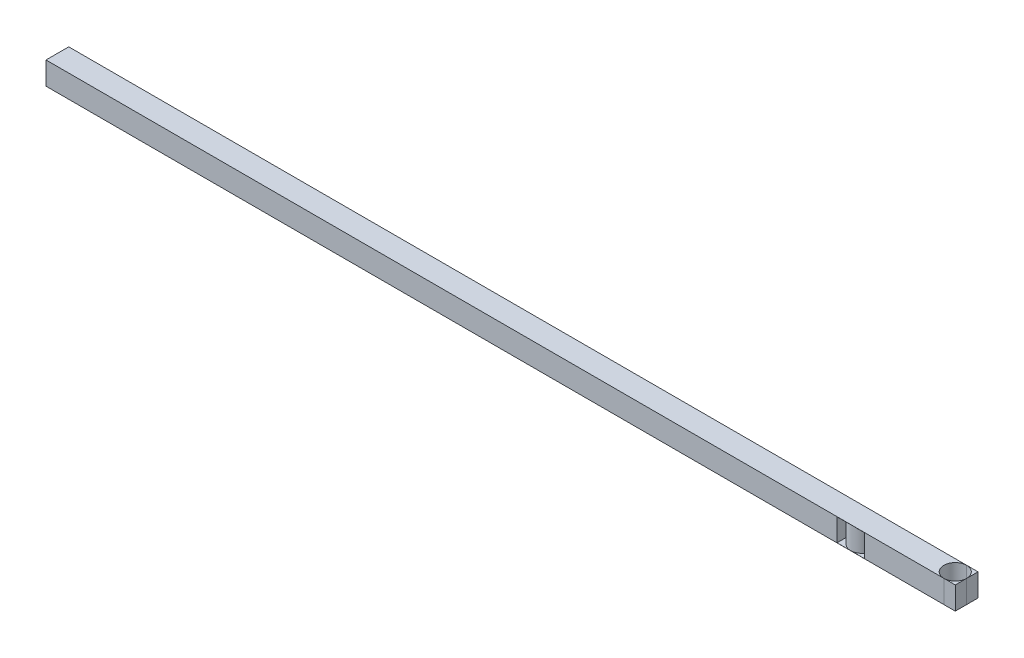
ISO-10303-21;
HEADER;
FILE_DESCRIPTION(('STEP AP214'),'2;1');
FILE_NAME('part.step','',(''),(''),'','','');
FILE_SCHEMA(('AUTOMOTIVE_DESIGN { 1 0 10303 214 1 1 1 1 }'));
ENDSEC;
DATA;
#1=APPLICATION_CONTEXT('core data for automotive mechanical design processes');
#2=APPLICATION_PROTOCOL_DEFINITION('international standard','automotive_design',2000,#1);
#3=PRODUCT_CONTEXT('',#1,'mechanical');
#4=PRODUCT('Part','Part','',(#3));
#5=PRODUCT_RELATED_PRODUCT_CATEGORY('part','',(#4));
#6=PRODUCT_DEFINITION_FORMATION('','',#4);
#7=PRODUCT_DEFINITION_CONTEXT('part definition',#1,'design');
#8=PRODUCT_DEFINITION('design','',#6,#7);
#9=PRODUCT_DEFINITION_SHAPE('','',#8);
#10=(LENGTH_UNIT() NAMED_UNIT(*) SI_UNIT(.MILLI.,.METRE.));
#11=(NAMED_UNIT(*) PLANE_ANGLE_UNIT() SI_UNIT($,.RADIAN.));
#12=(NAMED_UNIT(*) SI_UNIT($,.STERADIAN.) SOLID_ANGLE_UNIT());
#13=UNCERTAINTY_MEASURE_WITH_UNIT(LENGTH_MEASURE(1.E-05),#10,'distance_accuracy_value','');
#14=(GEOMETRIC_REPRESENTATION_CONTEXT(3) GLOBAL_UNCERTAINTY_ASSIGNED_CONTEXT((#13)) GLOBAL_UNIT_ASSIGNED_CONTEXT((#10,
#11,#12)) REPRESENTATION_CONTEXT('',''));
#15=CARTESIAN_POINT('',(0.,0.,0.));
#16=DIRECTION('',(0.,0.,1.));
#17=DIRECTION('',(1.,0.,0.));
#18=AXIS2_PLACEMENT_3D('',#15,#16,#17);
#19=CARTESIAN_POINT('',(0.,0.,0.));
#20=DIRECTION('',(0.,0.,-1.));
#21=DIRECTION('',(-1.,0.,0.));
#22=AXIS2_PLACEMENT_3D('',#19,#20,#21);
#23=PLANE('',#22);
#24=DIRECTION('',(-1.,0.,0.));
#25=VECTOR('',#24,1.);
#26=CARTESIAN_POINT('',(-100.,2.00000000000004,0.));
#27=LINE('',#26,#25);
#28=CARTESIAN_POINT('',(97.5,2.00000000000004,0.));
#29=VERTEX_POINT('',#28);
#30=CARTESIAN_POINT('',(-100.,2.00000000000004,0.));
#31=VERTEX_POINT('',#30);
#32=EDGE_CURVE('E12',#29,#31,#27,.T.);
#33=ORIENTED_EDGE('',*,*,#32,.F.);
#34=DIRECTION('',(0.,1.,0.));
#35=VECTOR('',#34,1.);
#36=CARTESIAN_POINT('',(97.5,-7.99999999999996,0.));
#37=LINE('',#36,#35);
#38=CARTESIAN_POINT('',(97.5,-3.00000000000002,0.));
#39=VERTEX_POINT('',#38);
#40=EDGE_CURVE('E165',#39,#29,#37,.T.);
#41=ORIENTED_EDGE('',*,*,#40,.F.);
#42=DIRECTION('',(1.,0.,0.));
#43=VECTOR('',#42,1.);
#44=CARTESIAN_POINT('',(100.,-3.00000000000002,0.));
#45=LINE('',#44,#43);
#46=CARTESIAN_POINT('',(-100.,-2.99999999999996,0.));
#47=VERTEX_POINT('',#46);
#48=EDGE_CURVE('E194',#47,#39,#45,.T.);
#49=ORIENTED_EDGE('',*,*,#48,.F.);
#50=DIRECTION('',(0.,-1.,0.));
#51=VECTOR('',#50,1.);
#52=CARTESIAN_POINT('',(-100.,2.00000000000004,0.));
#53=LINE('',#52,#51);
#54=EDGE_CURVE('E58',#31,#47,#53,.T.);
#55=ORIENTED_EDGE('',*,*,#54,.F.);
#56=EDGE_LOOP('',(#33,#41,#49,#55));
#57=FACE_BOUND('',#56,.T.);
#58=DIRECTION('',(0.,-1.,0.));
#59=VECTOR('',#58,1.);
#60=CARTESIAN_POINT('',(80.,0.,0.));
#61=LINE('',#60,#59);
#62=CARTESIAN_POINT('',(80.,1.97499999999999,0.));
#63=VERTEX_POINT('',#62);
#64=CARTESIAN_POINT('',(80.,-2.97500000000001,0.));
#65=VERTEX_POINT('',#64);
#66=EDGE_CURVE('E182',#63,#65,#61,.T.);
#67=ORIENTED_EDGE('',*,*,#66,.F.);
#68=DIRECTION('',(-1.,0.,0.));
#69=VECTOR('',#68,1.);
#70=CARTESIAN_POINT('',(0.,1.97500000000001,0.));
#71=LINE('',#70,#69);
#72=CARTESIAN_POINT('',(77.,1.97499999999999,0.));
#73=VERTEX_POINT('',#72);
#74=EDGE_CURVE('E185',#63,#73,#71,.T.);
#75=ORIENTED_EDGE('',*,*,#74,.T.);
#76=CARTESIAN_POINT('',(74.,1.97499999999999,0.));
#77=VERTEX_POINT('',#76);
#78=EDGE_CURVE('E141',#73,#77,#71,.T.);
#79=ORIENTED_EDGE('',*,*,#78,.T.);
#80=DIRECTION('',(0.,1.,0.));
#81=VECTOR('',#80,1.);
#82=CARTESIAN_POINT('',(74.,0.,0.));
#83=LINE('',#82,#81);
#84=CARTESIAN_POINT('',(74.,-2.97500000000001,0.));
#85=VERTEX_POINT('',#84);
#86=EDGE_CURVE('E179',#85,#77,#83,.T.);
#87=ORIENTED_EDGE('',*,*,#86,.F.);
#88=DIRECTION('',(-1.,0.,0.));
#89=VECTOR('',#88,1.);
#90=CARTESIAN_POINT('',(0.,-2.97499999999999,0.));
#91=LINE('',#90,#89);
#92=CARTESIAN_POINT('',(77.,-2.97500000000001,0.));
#93=VERTEX_POINT('',#92);
#94=EDGE_CURVE('E174',#93,#85,#91,.T.);
#95=ORIENTED_EDGE('',*,*,#94,.F.);
#96=EDGE_CURVE('E177',#65,#93,#91,.T.);
#97=ORIENTED_EDGE('',*,*,#96,.F.);
#98=EDGE_LOOP('',(#67,#75,#79,#87,#95,#97));
#99=FACE_BOUND('',#98,.T.);
#100=ADVANCED_FACE('F50',(#57,#99),#23,.T.);
#101=CARTESIAN_POINT('',(100.,-3.00000000000002,5.));
#102=DIRECTION('',(0.,1.,0.));
#103=DIRECTION('',(-1.,0.,0.));
#104=AXIS2_PLACEMENT_3D('',#101,#102,#103);
#105=PLANE('',#104);
#106=ORIENTED_EDGE('',*,*,#48,.T.);
#107=CARTESIAN_POINT('',(97.5,-3.00000000000002,2.5));
#108=DIRECTION('',(0.,1.,0.));
#109=DIRECTION('',(-1.,0.,0.));
#110=AXIS2_PLACEMENT_3D('',#107,#108,#109);
#111=CIRCLE('',#110,2.5);
#112=CARTESIAN_POINT('',(97.5,-3.00000000000002,5.));
#113=VERTEX_POINT('',#112);
#114=EDGE_CURVE('E164',#39,#113,#111,.T.);
#115=ORIENTED_EDGE('',*,*,#114,.T.);
#116=DIRECTION('',(1.,0.,0.));
#117=VECTOR('',#116,1.);
#118=CARTESIAN_POINT('',(100.,-3.00000000000002,5.));
#119=LINE('',#118,#117);
#120=CARTESIAN_POINT('',(-100.,-2.99999999999996,5.));
#121=VERTEX_POINT('',#120);
#122=EDGE_CURVE('E190',#121,#113,#119,.T.);
#123=ORIENTED_EDGE('',*,*,#122,.F.);
#124=DIRECTION('',(0.,0.,-1.));
#125=VECTOR('',#124,1.);
#126=CARTESIAN_POINT('',(-100.,-2.99999999999996,5.));
#127=LINE('',#126,#125);
#128=EDGE_CURVE('E72',#121,#47,#127,.T.);
#129=ORIENTED_EDGE('',*,*,#128,.T.);
#130=EDGE_LOOP('',(#106,#115,#123,#129));
#131=FACE_BOUND('',#130,.T.);
#132=ADVANCED_FACE('F207',(#131),#105,.F.);
#133=CARTESIAN_POINT('',(-100.,2.00000000000004,5.));
#134=DIRECTION('',(1.,0.,0.));
#135=DIRECTION('',(0.,0.,-1.));
#136=AXIS2_PLACEMENT_3D('',#133,#134,#135);
#137=PLANE('',#136);
#138=ORIENTED_EDGE('',*,*,#128,.F.);
#139=DIRECTION('',(0.,-1.,0.));
#140=VECTOR('',#139,1.);
#141=CARTESIAN_POINT('',(-100.,2.00000000000004,5.));
#142=LINE('',#141,#140);
#143=CARTESIAN_POINT('',(-100.,2.00000000000004,5.));
#144=VERTEX_POINT('',#143);
#145=EDGE_CURVE('E191',#144,#121,#142,.T.);
#146=ORIENTED_EDGE('',*,*,#145,.F.);
#147=DIRECTION('',(0.,0.,-1.));
#148=VECTOR('',#147,1.);
#149=CARTESIAN_POINT('',(-100.,2.00000000000004,5.));
#150=LINE('',#149,#148);
#151=EDGE_CURVE('E65',#144,#31,#150,.T.);
#152=ORIENTED_EDGE('',*,*,#151,.T.);
#153=ORIENTED_EDGE('',*,*,#54,.T.);
#154=EDGE_LOOP('',(#138,#146,#152,#153));
#155=FACE_BOUND('',#154,.T.);
#156=ADVANCED_FACE('F202',(#155),#137,.F.);
#157=CARTESIAN_POINT('',(-100.,2.00000000000004,5.));
#158=DIRECTION('',(0.,-1.,0.));
#159=DIRECTION('',(1.,0.,0.));
#160=AXIS2_PLACEMENT_3D('',#157,#158,#159);
#161=PLANE('',#160);
#162=ORIENTED_EDGE('',*,*,#151,.F.);
#163=DIRECTION('',(-1.,0.,0.));
#164=VECTOR('',#163,1.);
#165=CARTESIAN_POINT('',(-100.,2.00000000000004,5.));
#166=LINE('',#165,#164);
#167=CARTESIAN_POINT('',(97.5,2.00000000000004,5.));
#168=VERTEX_POINT('',#167);
#169=EDGE_CURVE('E195',#168,#144,#166,.T.);
#170=ORIENTED_EDGE('',*,*,#169,.F.);
#171=CARTESIAN_POINT('',(97.5,2.00000000000004,2.5));
#172=DIRECTION('',(0.,1.,0.));
#173=DIRECTION('',(-1.,0.,0.));
#174=AXIS2_PLACEMENT_3D('',#171,#172,#173);
#175=CIRCLE('',#174,2.5);
#176=EDGE_CURVE('E168',#29,#168,#175,.T.);
#177=ORIENTED_EDGE('',*,*,#176,.F.);
#178=ORIENTED_EDGE('',*,*,#32,.T.);
#179=EDGE_LOOP('',(#162,#170,#177,#178));
#180=FACE_BOUND('',#179,.T.);
#181=ADVANCED_FACE('F52',(#180),#161,.F.);
#182=CARTESIAN_POINT('',(0.,0.,5.));
#183=DIRECTION('',(0.,0.,-1.));
#184=DIRECTION('',(-1.,0.,0.));
#185=AXIS2_PLACEMENT_3D('',#182,#183,#184);
#186=PLANE('',#185);
#187=ORIENTED_EDGE('',*,*,#122,.T.);
#188=DIRECTION('',(0.,1.,0.));
#189=VECTOR('',#188,1.);
#190=CARTESIAN_POINT('',(97.5,-7.99999999999996,5.));
#191=LINE('',#190,#189);
#192=EDGE_CURVE('E169',#113,#168,#191,.T.);
#193=ORIENTED_EDGE('',*,*,#192,.T.);
#194=ORIENTED_EDGE('',*,*,#169,.T.);
#195=ORIENTED_EDGE('',*,*,#145,.T.);
#196=EDGE_LOOP('',(#187,#193,#194,#195));
#197=FACE_BOUND('',#196,.T.);
#198=DIRECTION('',(-1.,0.,0.));
#199=VECTOR('',#198,1.);
#200=CARTESIAN_POINT('',(0.,1.97500000000001,5.));
#201=LINE('',#200,#199);
#202=CARTESIAN_POINT('',(80.,1.97499999999999,5.));
#203=VERTEX_POINT('',#202);
#204=CARTESIAN_POINT('',(77.,1.97499999999999,5.00000000000001));
#205=VERTEX_POINT('',#204);
#206=EDGE_CURVE('E149',#203,#205,#201,.T.);
#207=ORIENTED_EDGE('',*,*,#206,.F.);
#208=DIRECTION('',(0.,-1.,0.));
#209=VECTOR('',#208,1.);
#210=CARTESIAN_POINT('',(80.,0.,5.));
#211=LINE('',#210,#209);
#212=CARTESIAN_POINT('',(80.,-2.97500000000001,5.));
#213=VERTEX_POINT('',#212);
#214=EDGE_CURVE('E158',#203,#213,#211,.T.);
#215=ORIENTED_EDGE('',*,*,#214,.T.);
#216=DIRECTION('',(-1.,0.,0.));
#217=VECTOR('',#216,1.);
#218=CARTESIAN_POINT('',(0.,-2.97499999999999,5.));
#219=LINE('',#218,#217);
#220=CARTESIAN_POINT('',(77.,-2.97500000000001,5.));
#221=VERTEX_POINT('',#220);
#222=EDGE_CURVE('E152',#213,#221,#219,.T.);
#223=ORIENTED_EDGE('',*,*,#222,.T.);
#224=CARTESIAN_POINT('',(74.,-2.97500000000001,5.));
#225=VERTEX_POINT('',#224);
#226=EDGE_CURVE('E334',#221,#225,#219,.T.);
#227=ORIENTED_EDGE('',*,*,#226,.T.);
#228=DIRECTION('',(0.,1.,0.));
#229=VECTOR('',#228,1.);
#230=CARTESIAN_POINT('',(74.,0.,5.));
#231=LINE('',#230,#229);
#232=CARTESIAN_POINT('',(74.,1.97499999999999,5.));
#233=VERTEX_POINT('',#232);
#234=EDGE_CURVE('E151',#225,#233,#231,.T.);
#235=ORIENTED_EDGE('',*,*,#234,.T.);
#236=EDGE_CURVE('E139',#205,#233,#201,.T.);
#237=ORIENTED_EDGE('',*,*,#236,.F.);
#238=EDGE_LOOP('',(#207,#215,#223,#227,#235,#237));
#239=FACE_BOUND('',#238,.T.);
#240=ADVANCED_FACE('F147',(#197,#239),#186,.F.);
#241=CARTESIAN_POINT('',(0.,1.97500000000001,0.));
#242=DIRECTION('',(0.,-1.,0.));
#243=DIRECTION('',(1.,0.,0.));
#244=AXIS2_PLACEMENT_3D('',#241,#242,#243);
#245=PLANE('',#244);
#246=ORIENTED_EDGE('',*,*,#78,.F.);
#247=CARTESIAN_POINT('',(77.,1.97499999999999,2.5));
#248=DIRECTION('',(0.,-1.,0.));
#249=DIRECTION('',(1.,0.,0.));
#250=AXIS2_PLACEMENT_3D('',#247,#248,#249);
#251=CIRCLE('',#250,2.50000000000001);
#252=EDGE_CURVE('E130',#205,#73,#251,.T.);
#253=ORIENTED_EDGE('',*,*,#252,.F.);
#254=ORIENTED_EDGE('',*,*,#236,.T.);
#255=DIRECTION('',(0.,0.,-1.));
#256=VECTOR('',#255,1.);
#257=CARTESIAN_POINT('',(74.,1.97499999999999,-0.286743203660138));
#258=LINE('',#257,#256);
#259=EDGE_CURVE('E343',#233,#77,#258,.T.);
#260=ORIENTED_EDGE('',*,*,#259,.T.);
#261=EDGE_LOOP('',(#246,#253,#254,#260));
#262=FACE_BOUND('',#261,.T.);
#263=ADVANCED_FACE('F137',(#262),#245,.T.);
#264=CARTESIAN_POINT('',(0.,-2.97499999999999,0.));
#265=DIRECTION('',(0.,-1.,0.));
#266=DIRECTION('',(1.,0.,0.));
#267=AXIS2_PLACEMENT_3D('',#264,#265,#266);
#268=PLANE('',#267);
#269=CARTESIAN_POINT('',(77.,-2.97500000000001,2.5));
#270=DIRECTION('',(0.,-1.,0.));
#271=DIRECTION('',(1.,0.,0.));
#272=AXIS2_PLACEMENT_3D('',#269,#270,#271);
#273=CIRCLE('',#272,2.50000000000001);
#274=EDGE_CURVE('E187',#93,#221,#273,.F.);
#275=ORIENTED_EDGE('',*,*,#274,.F.);
#276=ORIENTED_EDGE('',*,*,#94,.T.);
#277=DIRECTION('',(0.,0.,-1.));
#278=VECTOR('',#277,1.);
#279=CARTESIAN_POINT('',(74.,-2.97500000000001,-0.286743203660138));
#280=LINE('',#279,#278);
#281=EDGE_CURVE('E339',#225,#85,#280,.T.);
#282=ORIENTED_EDGE('',*,*,#281,.F.);
#283=ORIENTED_EDGE('',*,*,#226,.F.);
#284=EDGE_LOOP('',(#275,#276,#282,#283));
#285=FACE_BOUND('',#284,.T.);
#286=ADVANCED_FACE('F230',(#285),#268,.F.);
#287=CARTESIAN_POINT('',(97.5,-7.99999999999996,2.5));
#288=DIRECTION('',(0.,1.,0.));
#289=DIRECTION('',(-1.,0.,0.));
#290=AXIS2_PLACEMENT_3D('',#287,#288,#289);
#291=CYLINDRICAL_SURFACE('',#290,2.5);
#292=ORIENTED_EDGE('',*,*,#114,.F.);
#293=ORIENTED_EDGE('',*,*,#40,.T.);
#294=ORIENTED_EDGE('',*,*,#176,.T.);
#295=ORIENTED_EDGE('',*,*,#192,.F.);
#296=EDGE_LOOP('',(#292,#293,#294,#295));
#297=FACE_BOUND('',#296,.T.);
#298=ADVANCED_FACE('F210',(#297),#291,.F.);
#299=CARTESIAN_POINT('',(80.,1.97499999999999,-0.286743203660138));
#300=DIRECTION('',(1.,0.,0.));
#301=DIRECTION('',(0.,1.,0.));
#302=AXIS2_PLACEMENT_3D('',#299,#300,#301);
#303=PLANE('',#302);
#304=DIRECTION('',(0.,0.,1.));
#305=VECTOR('',#304,1.);
#306=CARTESIAN_POINT('',(80.,1.97499999999999,-0.286743203660138));
#307=LINE('',#306,#305);
#308=EDGE_CURVE('E157',#63,#203,#307,.T.);
#309=ORIENTED_EDGE('',*,*,#308,.F.);
#310=ORIENTED_EDGE('',*,*,#66,.T.);
#311=DIRECTION('',(0.,0.,1.));
#312=VECTOR('',#311,1.);
#313=CARTESIAN_POINT('',(80.,-2.97500000000001,-0.286743203660138));
#314=LINE('',#313,#312);
#315=EDGE_CURVE('E336',#65,#213,#314,.T.);
#316=ORIENTED_EDGE('',*,*,#315,.T.);
#317=ORIENTED_EDGE('',*,*,#214,.F.);
#318=EDGE_LOOP('',(#309,#310,#316,#317));
#319=FACE_BOUND('',#318,.T.);
#320=ADVANCED_FACE('F229',(#319),#303,.F.);
#321=CARTESIAN_POINT('',(74.,1.97499999999999,-0.286743203660138));
#322=DIRECTION('',(-1.,0.,0.));
#323=DIRECTION('',(0.,-1.,0.));
#324=AXIS2_PLACEMENT_3D('',#321,#322,#323);
#325=PLANE('',#324);
#326=ORIENTED_EDGE('',*,*,#281,.T.);
#327=ORIENTED_EDGE('',*,*,#86,.T.);
#328=ORIENTED_EDGE('',*,*,#259,.F.);
#329=ORIENTED_EDGE('',*,*,#234,.F.);
#330=EDGE_LOOP('',(#326,#327,#328,#329));
#331=FACE_BOUND('',#330,.T.);
#332=ADVANCED_FACE('F233',(#331),#325,.F.);
#333=ORIENTED_EDGE('',*,*,#206,.T.);
#334=EDGE_CURVE('E126',#73,#205,#251,.T.);
#335=ORIENTED_EDGE('',*,*,#334,.F.);
#336=ORIENTED_EDGE('',*,*,#74,.F.);
#337=ORIENTED_EDGE('',*,*,#308,.T.);
#338=EDGE_LOOP('',(#333,#335,#336,#337));
#339=FACE_BOUND('',#338,.T.);
#340=ADVANCED_FACE('F155',(#339),#245,.T.);
#341=CARTESIAN_POINT('',(77.,-2.97500000000001,2.5));
#342=DIRECTION('',(0.,1.,0.));
#343=DIRECTION('',(-1.,0.,0.));
#344=AXIS2_PLACEMENT_3D('',#341,#342,#343);
#345=CIRCLE('',#344,2.50000000000001);
#346=EDGE_CURVE('E143',#221,#93,#345,.T.);
#347=ORIENTED_EDGE('',*,*,#346,.F.);
#348=ORIENTED_EDGE('',*,*,#222,.F.);
#349=ORIENTED_EDGE('',*,*,#315,.F.);
#350=ORIENTED_EDGE('',*,*,#96,.T.);
#351=EDGE_LOOP('',(#347,#348,#349,#350));
#352=FACE_BOUND('',#351,.T.);
#353=ADVANCED_FACE('F238',(#352),#268,.F.);
#354=CARTESIAN_POINT('',(77.,2.00199999999999,2.5));
#355=DIRECTION('',(0.,-1.,0.));
#356=DIRECTION('',(1.,0.,0.));
#357=AXIS2_PLACEMENT_3D('',#354,#355,#356);
#358=CYLINDRICAL_SURFACE('',#357,2.50000000000001);
#359=ORIENTED_EDGE('',*,*,#252,.T.);
#360=ORIENTED_EDGE('',*,*,#334,.T.);
#361=EDGE_LOOP('',(#359,#360));
#362=FACE_BOUND('',#361,.T.);
#363=ORIENTED_EDGE('',*,*,#346,.T.);
#364=ORIENTED_EDGE('',*,*,#274,.T.);
#365=EDGE_LOOP('',(#363,#364));
#366=FACE_BOUND('',#365,.T.);
#367=ADVANCED_FACE('F128',(#362,#366),#358,.T.);
#368=CLOSED_SHELL('',(#100,#132,#156,#181,#240,#263,#286,#298,#320,#332,#340,#353,#367));
#369=MANIFOLD_SOLID_BREP('B2',#368);
#370=CARTESIAN_POINT('',(0.,0.,0.));
#371=DIRECTION('',(0.,0.,-1.));
#372=DIRECTION('',(-1.,0.,0.));
#373=AXIS2_PLACEMENT_3D('',#370,#371,#372);
#374=PLANE('',#373);
#375=DIRECTION('',(1.,0.,0.));
#376=VECTOR('',#375,1.);
#377=CARTESIAN_POINT('',(100.,-3.00000000000002,0.));
#378=LINE('',#377,#376);
#379=CARTESIAN_POINT('',(97.5,-2.99999999999999,0.));
#380=VERTEX_POINT('',#379);
#381=CARTESIAN_POINT('',(100.,-3.00000000000002,0.));
#382=VERTEX_POINT('',#381);
#383=EDGE_CURVE('E398',#380,#382,#378,.T.);
#384=ORIENTED_EDGE('',*,*,#383,.F.);
#385=DIRECTION('',(0.,1.,0.));
#386=VECTOR('',#385,1.);
#387=CARTESIAN_POINT('',(97.5,-7.99999999999996,0.));
#388=LINE('',#387,#386);
#389=CARTESIAN_POINT('',(97.5,2.00000000000004,0.));
#390=VERTEX_POINT('',#389);
#391=EDGE_CURVE('E363',#380,#390,#388,.T.);
#392=ORIENTED_EDGE('',*,*,#391,.T.);
#393=DIRECTION('',(-1.,0.,0.));
#394=VECTOR('',#393,1.);
#395=CARTESIAN_POINT('',(-100.,2.00000000000004,0.));
#396=LINE('',#395,#394);
#397=CARTESIAN_POINT('',(100.,2.00000000000004,0.));
#398=VERTEX_POINT('',#397);
#399=EDGE_CURVE('E407',#398,#390,#396,.T.);
#400=ORIENTED_EDGE('',*,*,#399,.F.);
#401=DIRECTION('',(0.,1.,0.));
#402=VECTOR('',#401,1.);
#403=CARTESIAN_POINT('',(100.,2.00000000000004,0.));
#404=LINE('',#403,#402);
#405=EDGE_CURVE('E403',#382,#398,#404,.T.);
#406=ORIENTED_EDGE('',*,*,#405,.F.);
#407=EDGE_LOOP('',(#384,#392,#400,#406));
#408=FACE_BOUND('',#407,.T.);
#409=ADVANCED_FACE('F359',(#408),#374,.T.);
#410=CARTESIAN_POINT('',(-100.,2.00000000000004,5.));
#411=DIRECTION('',(0.,-1.,0.));
#412=DIRECTION('',(1.,0.,0.));
#413=AXIS2_PLACEMENT_3D('',#410,#411,#412);
#414=PLANE('',#413);
#415=ORIENTED_EDGE('',*,*,#399,.T.);
#416=CARTESIAN_POINT('',(97.5,2.00000000000004,2.5));
#417=DIRECTION('',(0.,1.,0.));
#418=DIRECTION('',(-1.,0.,0.));
#419=AXIS2_PLACEMENT_3D('',#416,#417,#418);
#420=CIRCLE('',#419,2.5);
#421=CARTESIAN_POINT('',(100.,2.00000000000004,2.5));
#422=VERTEX_POINT('',#421);
#423=EDGE_CURVE('E48',#422,#390,#420,.T.);
#424=ORIENTED_EDGE('',*,*,#423,.F.);
#425=DIRECTION('',(0.,0.,-1.));
#426=VECTOR('',#425,1.);
#427=CARTESIAN_POINT('',(100.,2.00000000000004,5.));
#428=LINE('',#427,#426);
#429=EDGE_CURVE('E400',#422,#398,#428,.T.);
#430=ORIENTED_EDGE('',*,*,#429,.T.);
#431=EDGE_LOOP('',(#415,#424,#430));
#432=FACE_BOUND('',#431,.T.);
#433=ADVANCED_FACE('F409',(#432),#414,.F.);
#434=CARTESIAN_POINT('',(100.,2.00000000000004,5.));
#435=DIRECTION('',(-1.,0.,0.));
#436=DIRECTION('',(0.,0.,1.));
#437=AXIS2_PLACEMENT_3D('',#434,#435,#436);
#438=PLANE('',#437);
#439=DIRECTION('',(0.,1.,0.));
#440=VECTOR('',#439,1.);
#441=CARTESIAN_POINT('',(100.,-7.99999999999996,2.5));
#442=LINE('',#441,#440);
#443=CARTESIAN_POINT('',(100.,-3.00000000000002,2.5));
#444=VERTEX_POINT('',#443);
#445=EDGE_CURVE('E368',#444,#422,#442,.T.);
#446=ORIENTED_EDGE('',*,*,#445,.F.);
#447=DIRECTION('',(0.,0.,-1.));
#448=VECTOR('',#447,1.);
#449=CARTESIAN_POINT('',(100.,-3.00000000000002,5.));
#450=LINE('',#449,#448);
#451=EDGE_CURVE('E393',#444,#382,#450,.T.);
#452=ORIENTED_EDGE('',*,*,#451,.T.);
#453=ORIENTED_EDGE('',*,*,#405,.T.);
#454=ORIENTED_EDGE('',*,*,#429,.F.);
#455=EDGE_LOOP('',(#446,#452,#453,#454));
#456=FACE_BOUND('',#455,.T.);
#457=ADVANCED_FACE('F401',(#456),#438,.F.);
#458=CARTESIAN_POINT('',(100.,-3.00000000000002,5.));
#459=DIRECTION('',(0.,1.,0.));
#460=DIRECTION('',(-1.,0.,0.));
#461=AXIS2_PLACEMENT_3D('',#458,#459,#460);
#462=PLANE('',#461);
#463=ORIENTED_EDGE('',*,*,#451,.F.);
#464=CARTESIAN_POINT('',(97.5,-3.00000000000002,2.5));
#465=DIRECTION('',(0.,1.,0.));
#466=DIRECTION('',(-1.,0.,0.));
#467=AXIS2_PLACEMENT_3D('',#464,#465,#466);
#468=CIRCLE('',#467,2.5);
#469=EDGE_CURVE('E376',#444,#380,#468,.T.);
#470=ORIENTED_EDGE('',*,*,#469,.T.);
#471=ORIENTED_EDGE('',*,*,#383,.T.);
#472=EDGE_LOOP('',(#463,#470,#471));
#473=FACE_BOUND('',#472,.T.);
#474=ADVANCED_FACE('F361',(#473),#462,.F.);
#475=CARTESIAN_POINT('',(97.5,-7.99999999999996,2.5));
#476=DIRECTION('',(0.,1.,0.));
#477=DIRECTION('',(-1.,0.,0.));
#478=AXIS2_PLACEMENT_3D('',#475,#476,#477);
#479=CYLINDRICAL_SURFACE('',#478,2.5);
#480=ORIENTED_EDGE('',*,*,#445,.T.);
#481=ORIENTED_EDGE('',*,*,#423,.T.);
#482=ORIENTED_EDGE('',*,*,#391,.F.);
#483=ORIENTED_EDGE('',*,*,#469,.F.);
#484=EDGE_LOOP('',(#480,#481,#482,#483));
#485=FACE_BOUND('',#484,.T.);
#486=ADVANCED_FACE('F396',(#485),#479,.F.);
#487=CLOSED_SHELL('',(#409,#433,#457,#474,#486));
#488=MANIFOLD_SOLID_BREP('B6',#487);
#489=CARTESIAN_POINT('',(0.,0.,5.));
#490=DIRECTION('',(0.,0.,-1.));
#491=DIRECTION('',(-1.,0.,0.));
#492=AXIS2_PLACEMENT_3D('',#489,#490,#491);
#493=PLANE('',#492);
#494=DIRECTION('',(0.,1.,0.));
#495=VECTOR('',#494,1.);
#496=CARTESIAN_POINT('',(97.5,-7.99999999999996,5.));
#497=LINE('',#496,#495);
#498=CARTESIAN_POINT('',(97.5,-3.00000000000002,5.));
#499=VERTEX_POINT('',#498);
#500=CARTESIAN_POINT('',(97.5,2.00000000000004,5.));
#501=VERTEX_POINT('',#500);
#502=EDGE_CURVE('E472',#499,#501,#497,.T.);
#503=ORIENTED_EDGE('',*,*,#502,.F.);
#504=DIRECTION('',(1.,0.,0.));
#505=VECTOR('',#504,1.);
#506=CARTESIAN_POINT('',(100.,-3.00000000000002,5.));
#507=LINE('',#506,#505);
#508=CARTESIAN_POINT('',(100.,-3.00000000000002,5.));
#509=VERTEX_POINT('',#508);
#510=EDGE_CURVE('E508',#499,#509,#507,.T.);
#511=ORIENTED_EDGE('',*,*,#510,.T.);
#512=DIRECTION('',(0.,1.,0.));
#513=VECTOR('',#512,1.);
#514=CARTESIAN_POINT('',(100.,2.00000000000004,5.));
#515=LINE('',#514,#513);
#516=CARTESIAN_POINT('',(100.,2.00000000000004,5.));
#517=VERTEX_POINT('',#516);
#518=EDGE_CURVE('E504',#509,#517,#515,.T.);
#519=ORIENTED_EDGE('',*,*,#518,.T.);
#520=DIRECTION('',(-1.,0.,0.));
#521=VECTOR('',#520,1.);
#522=CARTESIAN_POINT('',(-100.,2.00000000000004,5.));
#523=LINE('',#522,#521);
#524=EDGE_CURVE('E503',#517,#501,#523,.T.);
#525=ORIENTED_EDGE('',*,*,#524,.T.);
#526=EDGE_LOOP('',(#503,#511,#519,#525));
#527=FACE_BOUND('',#526,.T.);
#528=ADVANCED_FACE('F457',(#527),#493,.F.);
#529=CARTESIAN_POINT('',(-100.,2.00000000000004,5.));
#530=DIRECTION('',(0.,-1.,0.));
#531=DIRECTION('',(1.,0.,0.));
#532=AXIS2_PLACEMENT_3D('',#529,#530,#531);
#533=PLANE('',#532);
#534=DIRECTION('',(0.,0.,-1.));
#535=VECTOR('',#534,1.);
#536=CARTESIAN_POINT('',(100.,2.00000000000004,5.));
#537=LINE('',#536,#535);
#538=CARTESIAN_POINT('',(100.,2.00000000000004,2.5));
#539=VERTEX_POINT('',#538);
#540=EDGE_CURVE('E465',#517,#539,#537,.T.);
#541=ORIENTED_EDGE('',*,*,#540,.T.);
#542=CARTESIAN_POINT('',(97.5,2.00000000000004,2.5));
#543=DIRECTION('',(0.,1.,0.));
#544=DIRECTION('',(-1.,0.,0.));
#545=AXIS2_PLACEMENT_3D('',#542,#543,#544);
#546=CIRCLE('',#545,2.5);
#547=EDGE_CURVE('E488',#501,#539,#546,.T.);
#548=ORIENTED_EDGE('',*,*,#547,.F.);
#549=ORIENTED_EDGE('',*,*,#524,.F.);
#550=EDGE_LOOP('',(#541,#548,#549));
#551=FACE_BOUND('',#550,.T.);
#552=ADVANCED_FACE('F502',(#551),#533,.F.);
#553=CARTESIAN_POINT('',(100.,2.00000000000004,5.));
#554=DIRECTION('',(-1.,0.,0.));
#555=DIRECTION('',(0.,0.,1.));
#556=AXIS2_PLACEMENT_3D('',#553,#554,#555);
#557=PLANE('',#556);
#558=DIRECTION('',(0.,0.,-1.));
#559=VECTOR('',#558,1.);
#560=CARTESIAN_POINT('',(100.,-3.00000000000002,5.));
#561=LINE('',#560,#559);
#562=CARTESIAN_POINT('',(100.,-3.00000000000002,2.5));
#563=VERTEX_POINT('',#562);
#564=EDGE_CURVE('E357',#509,#563,#561,.T.);
#565=ORIENTED_EDGE('',*,*,#564,.T.);
#566=DIRECTION('',(0.,1.,0.));
#567=VECTOR('',#566,1.);
#568=CARTESIAN_POINT('',(100.,-7.99999999999996,2.5));
#569=LINE('',#568,#567);
#570=EDGE_CURVE('E477',#563,#539,#569,.T.);
#571=ORIENTED_EDGE('',*,*,#570,.T.);
#572=ORIENTED_EDGE('',*,*,#540,.F.);
#573=ORIENTED_EDGE('',*,*,#518,.F.);
#574=EDGE_LOOP('',(#565,#571,#572,#573));
#575=FACE_BOUND('',#574,.T.);
#576=ADVANCED_FACE('F497',(#575),#557,.F.);
#577=CARTESIAN_POINT('',(100.,-3.00000000000002,5.));
#578=DIRECTION('',(0.,1.,0.));
#579=DIRECTION('',(-1.,0.,0.));
#580=AXIS2_PLACEMENT_3D('',#577,#578,#579);
#581=PLANE('',#580);
#582=ORIENTED_EDGE('',*,*,#510,.F.);
#583=CARTESIAN_POINT('',(97.5,-3.00000000000002,2.5));
#584=DIRECTION('',(0.,1.,0.));
#585=DIRECTION('',(-1.,0.,0.));
#586=AXIS2_PLACEMENT_3D('',#583,#584,#585);
#587=CIRCLE('',#586,2.5);
#588=EDGE_CURVE('E493',#499,#563,#587,.T.);
#589=ORIENTED_EDGE('',*,*,#588,.T.);
#590=ORIENTED_EDGE('',*,*,#564,.F.);
#591=EDGE_LOOP('',(#582,#589,#590));
#592=FACE_BOUND('',#591,.T.);
#593=ADVANCED_FACE('F459',(#592),#581,.F.);
#594=CARTESIAN_POINT('',(97.5,-7.99999999999996,2.5));
#595=DIRECTION('',(0.,1.,0.));
#596=DIRECTION('',(-1.,0.,0.));
#597=AXIS2_PLACEMENT_3D('',#594,#595,#596);
#598=CYLINDRICAL_SURFACE('',#597,2.5);
#599=ORIENTED_EDGE('',*,*,#502,.T.);
#600=ORIENTED_EDGE('',*,*,#547,.T.);
#601=ORIENTED_EDGE('',*,*,#570,.F.);
#602=ORIENTED_EDGE('',*,*,#588,.F.);
#603=EDGE_LOOP('',(#599,#600,#601,#602));
#604=FACE_BOUND('',#603,.T.);
#605=ADVANCED_FACE('F489',(#604),#598,.F.);
#606=CLOSED_SHELL('',(#528,#552,#576,#593,#605));
#607=MANIFOLD_SOLID_BREP('B42',#606);
#608=ADVANCED_BREP_SHAPE_REPRESENTATION('',(#18,#369,#488,#607),#14);
#609=SHAPE_DEFINITION_REPRESENTATION(#9,#608);
ENDSEC;
END-ISO-10303-21;
